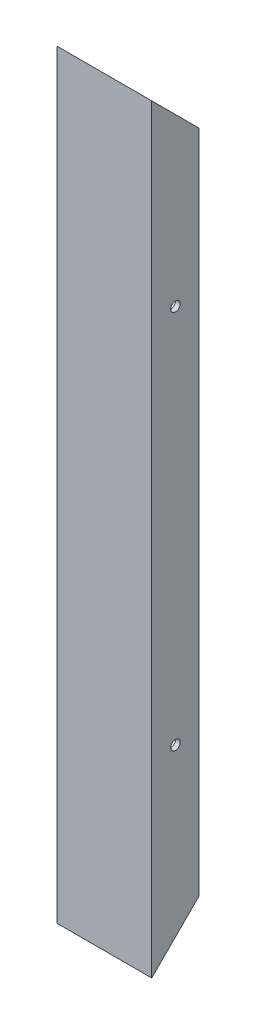
ISO-10303-21;
HEADER;
FILE_DESCRIPTION(('STEP AP214'),'2;1');
FILE_NAME('part.step','',(''),(''),'','','');
FILE_SCHEMA(('AUTOMOTIVE_DESIGN { 1 0 10303 214 1 1 1 1 }'));
ENDSEC;
DATA;
#1=APPLICATION_CONTEXT('core data for automotive mechanical design processes');
#2=APPLICATION_PROTOCOL_DEFINITION('international standard','automotive_design',2000,#1);
#3=PRODUCT_CONTEXT('',#1,'mechanical');
#4=PRODUCT('Part','Part','',(#3));
#5=PRODUCT_RELATED_PRODUCT_CATEGORY('part','',(#4));
#6=PRODUCT_DEFINITION_FORMATION('','',#4);
#7=PRODUCT_DEFINITION_CONTEXT('part definition',#1,'design');
#8=PRODUCT_DEFINITION('design','',#6,#7);
#9=PRODUCT_DEFINITION_SHAPE('','',#8);
#10=(LENGTH_UNIT() NAMED_UNIT(*) SI_UNIT(.MILLI.,.METRE.));
#11=(NAMED_UNIT(*) PLANE_ANGLE_UNIT() SI_UNIT($,.RADIAN.));
#12=(NAMED_UNIT(*) SI_UNIT($,.STERADIAN.) SOLID_ANGLE_UNIT());
#13=UNCERTAINTY_MEASURE_WITH_UNIT(LENGTH_MEASURE(1.E-05),#10,'distance_accuracy_value','');
#14=(GEOMETRIC_REPRESENTATION_CONTEXT(3) GLOBAL_UNCERTAINTY_ASSIGNED_CONTEXT((#13)) GLOBAL_UNIT_ASSIGNED_CONTEXT((#10,
#11,#12)) REPRESENTATION_CONTEXT('',''));
#15=CARTESIAN_POINT('',(0.,0.,0.));
#16=DIRECTION('',(0.,0.,1.));
#17=DIRECTION('',(1.,0.,0.));
#18=AXIS2_PLACEMENT_3D('',#15,#16,#17);
#19=CARTESIAN_POINT('',(-100.,0.,0.));
#20=DIRECTION('',(0.,0.,1.));
#21=DIRECTION('',(1.,0.,0.));
#22=AXIS2_PLACEMENT_3D('',#19,#20,#21);
#23=PLANE('',#22);
#24=DIRECTION('',(-1.,0.,0.));
#25=VECTOR('',#24,1.);
#26=CARTESIAN_POINT('',(0.,0.,0.));
#27=LINE('',#26,#25);
#28=CARTESIAN_POINT('',(0.,0.,0.));
#29=VERTEX_POINT('',#28);
#30=CARTESIAN_POINT('',(-100.,0.,0.));
#31=VERTEX_POINT('',#30);
#32=EDGE_CURVE('E175',#29,#31,#27,.T.);
#33=ORIENTED_EDGE('',*,*,#32,.F.);
#34=DIRECTION('',(0.,1.,0.));
#35=VECTOR('',#34,1.);
#36=CARTESIAN_POINT('',(0.,0.,0.));
#37=LINE('',#36,#35);
#38=CARTESIAN_POINT('',(0.,800.,0.));
#39=VERTEX_POINT('',#38);
#40=EDGE_CURVE('E196',#29,#39,#37,.T.);
#41=ORIENTED_EDGE('',*,*,#40,.T.);
#42=DIRECTION('',(1.,0.,0.));
#43=VECTOR('',#42,1.);
#44=CARTESIAN_POINT('',(0.,800.,0.));
#45=LINE('',#44,#43);
#46=CARTESIAN_POINT('',(-100.,800.,0.));
#47=VERTEX_POINT('',#46);
#48=EDGE_CURVE('E166',#47,#39,#45,.T.);
#49=ORIENTED_EDGE('',*,*,#48,.F.);
#50=DIRECTION('',(0.,1.,0.));
#51=VECTOR('',#50,1.);
#52=CARTESIAN_POINT('',(-100.,0.,0.));
#53=LINE('',#52,#51);
#54=EDGE_CURVE('E142',#31,#47,#53,.T.);
#55=ORIENTED_EDGE('',*,*,#54,.F.);
#56=EDGE_LOOP('',(#33,#41,#49,#55));
#57=FACE_BOUND('',#56,.T.);
#58=ADVANCED_FACE('F17',(#57),#23,.T.);
#59=CARTESIAN_POINT('',(-5.,0.,-5.));
#60=DIRECTION('',(0.,0.,-1.));
#61=DIRECTION('',(0.,-1.,0.));
#62=AXIS2_PLACEMENT_3D('',#59,#60,#61);
#63=PLANE('',#62);
#64=DIRECTION('',(1.,0.,0.));
#65=VECTOR('',#64,1.);
#66=CARTESIAN_POINT('',(-2.5,795.,-5.));
#67=LINE('',#66,#65);
#68=CARTESIAN_POINT('',(-95.,795.,-5.));
#69=VERTEX_POINT('',#68);
#70=CARTESIAN_POINT('',(-5.,795.,-5.));
#71=VERTEX_POINT('',#70);
#72=EDGE_CURVE('E21',#69,#71,#67,.T.);
#73=ORIENTED_EDGE('',*,*,#72,.T.);
#74=DIRECTION('',(0.,1.,0.));
#75=VECTOR('',#74,1.);
#76=CARTESIAN_POINT('',(-5.,0.,-5.));
#77=LINE('',#76,#75);
#78=CARTESIAN_POINT('',(-5.,5.,-5.));
#79=VERTEX_POINT('',#78);
#80=EDGE_CURVE('E208',#79,#71,#77,.T.);
#81=ORIENTED_EDGE('',*,*,#80,.F.);
#82=DIRECTION('',(-1.,0.,0.));
#83=VECTOR('',#82,1.);
#84=CARTESIAN_POINT('',(-2.5,5.,-5.));
#85=LINE('',#84,#83);
#86=CARTESIAN_POINT('',(-95.,5.,-5.));
#87=VERTEX_POINT('',#86);
#88=EDGE_CURVE('E221',#79,#87,#85,.T.);
#89=ORIENTED_EDGE('',*,*,#88,.T.);
#90=DIRECTION('',(0.,1.,0.));
#91=VECTOR('',#90,1.);
#92=CARTESIAN_POINT('',(-95.,0.,-5.));
#93=LINE('',#92,#91);
#94=EDGE_CURVE('E11',#87,#69,#93,.T.);
#95=ORIENTED_EDGE('',*,*,#94,.T.);
#96=EDGE_LOOP('',(#73,#81,#89,#95));
#97=FACE_BOUND('',#96,.T.);
#98=ADVANCED_FACE('F19',(#97),#63,.T.);
#99=CARTESIAN_POINT('',(-95.,0.,-5.));
#100=DIRECTION('',(1.,0.,0.));
#101=DIRECTION('',(0.,1.,0.));
#102=AXIS2_PLACEMENT_3D('',#99,#100,#101);
#103=PLANE('',#102);
#104=CARTESIAN_POINT('',(-95.,600.,-25.));
#105=DIRECTION('',(-1.,0.,0.));
#106=DIRECTION('',(0.,0.,1.));
#107=AXIS2_PLACEMENT_3D('',#104,#105,#106);
#108=CIRCLE('',#107,5.);
#109=CARTESIAN_POINT('',(-95.,600.,-30.));
#110=VERTEX_POINT('',#109);
#111=EDGE_CURVE('E190',#110,#110,#108,.T.);
#112=ORIENTED_EDGE('',*,*,#111,.T.);
#113=EDGE_LOOP('',(#112));
#114=FACE_BOUND('',#113,.T.);
#115=CARTESIAN_POINT('',(-95.,200.,-25.));
#116=DIRECTION('',(-1.,0.,0.));
#117=DIRECTION('',(0.,0.,1.));
#118=AXIS2_PLACEMENT_3D('',#115,#116,#117);
#119=CIRCLE('',#118,5.);
#120=CARTESIAN_POINT('',(-95.,200.,-30.));
#121=VERTEX_POINT('',#120);
#122=EDGE_CURVE('E257',#121,#121,#119,.T.);
#123=ORIENTED_EDGE('',*,*,#122,.T.);
#124=EDGE_LOOP('',(#123));
#125=FACE_BOUND('',#124,.T.);
#126=DIRECTION('',(0.,0.707106781186546,0.707106781186549));
#127=VECTOR('',#126,1.);
#128=CARTESIAN_POINT('',(-95.,573.75,-226.25));
#129=LINE('',#128,#127);
#130=CARTESIAN_POINT('',(-95.,750.,-50.));
#131=VERTEX_POINT('',#130);
#132=EDGE_CURVE('E135',#131,#69,#129,.T.);
#133=ORIENTED_EDGE('',*,*,#132,.T.);
#134=ORIENTED_EDGE('',*,*,#94,.F.);
#135=DIRECTION('',(0.,0.707106781186548,-0.707106781186548));
#136=VECTOR('',#135,1.);
#137=CARTESIAN_POINT('',(-95.,1.25,-1.25));
#138=LINE('',#137,#136);
#139=CARTESIAN_POINT('',(-95.,50.,-50.));
#140=VERTEX_POINT('',#139);
#141=EDGE_CURVE('E138',#87,#140,#138,.T.);
#142=ORIENTED_EDGE('',*,*,#141,.T.);
#143=DIRECTION('',(0.,1.,0.));
#144=VECTOR('',#143,1.);
#145=CARTESIAN_POINT('',(-95.,0.,-50.));
#146=LINE('',#145,#144);
#147=EDGE_CURVE('E28',#140,#131,#146,.T.);
#148=ORIENTED_EDGE('',*,*,#147,.T.);
#149=EDGE_LOOP('',(#133,#134,#142,#148));
#150=FACE_BOUND('',#149,.T.);
#151=ADVANCED_FACE('F133',(#114,#125,#150),#103,.T.);
#152=CARTESIAN_POINT('',(-95.,0.,-50.));
#153=DIRECTION('',(0.,0.,-1.));
#154=DIRECTION('',(0.,-1.,0.));
#155=AXIS2_PLACEMENT_3D('',#152,#153,#154);
#156=PLANE('',#155);
#157=DIRECTION('',(1.,0.,0.));
#158=VECTOR('',#157,1.);
#159=CARTESIAN_POINT('',(-47.5,750.,-50.));
#160=LINE('',#159,#158);
#161=CARTESIAN_POINT('',(-100.,750.,-50.));
#162=VERTEX_POINT('',#161);
#163=EDGE_CURVE('E145',#162,#131,#160,.T.);
#164=ORIENTED_EDGE('',*,*,#163,.T.);
#165=ORIENTED_EDGE('',*,*,#147,.F.);
#166=DIRECTION('',(-1.,0.,0.));
#167=VECTOR('',#166,1.);
#168=CARTESIAN_POINT('',(-47.5,50.,-50.));
#169=LINE('',#168,#167);
#170=CARTESIAN_POINT('',(-100.,50.,-50.));
#171=VERTEX_POINT('',#170);
#172=EDGE_CURVE('E209',#140,#171,#169,.T.);
#173=ORIENTED_EDGE('',*,*,#172,.T.);
#174=DIRECTION('',(0.,1.,0.));
#175=VECTOR('',#174,1.);
#176=CARTESIAN_POINT('',(-100.,0.,-50.));
#177=LINE('',#176,#175);
#178=EDGE_CURVE('E41',#171,#162,#177,.T.);
#179=ORIENTED_EDGE('',*,*,#178,.T.);
#180=EDGE_LOOP('',(#164,#165,#173,#179));
#181=FACE_BOUND('',#180,.T.);
#182=ADVANCED_FACE('F146',(#181),#156,.T.);
#183=CARTESIAN_POINT('',(-100.,0.,-50.));
#184=DIRECTION('',(-1.,0.,0.));
#185=DIRECTION('',(0.,0.,1.));
#186=AXIS2_PLACEMENT_3D('',#183,#184,#185);
#187=PLANE('',#186);
#188=CARTESIAN_POINT('',(-100.,600.,-25.));
#189=DIRECTION('',(1.,0.,0.));
#190=DIRECTION('',(0.,0.,1.));
#191=AXIS2_PLACEMENT_3D('',#188,#189,#190);
#192=CIRCLE('',#191,5.);
#193=CARTESIAN_POINT('',(-100.,600.,-30.));
#194=VERTEX_POINT('',#193);
#195=EDGE_CURVE('E192',#194,#194,#192,.T.);
#196=ORIENTED_EDGE('',*,*,#195,.T.);
#197=EDGE_LOOP('',(#196));
#198=FACE_BOUND('',#197,.T.);
#199=CARTESIAN_POINT('',(-100.,200.,-25.));
#200=DIRECTION('',(1.,0.,0.));
#201=DIRECTION('',(0.,0.,1.));
#202=AXIS2_PLACEMENT_3D('',#199,#200,#201);
#203=CIRCLE('',#202,5.);
#204=CARTESIAN_POINT('',(-100.,200.,-30.));
#205=VERTEX_POINT('',#204);
#206=EDGE_CURVE('E187',#205,#205,#203,.T.);
#207=ORIENTED_EDGE('',*,*,#206,.T.);
#208=EDGE_LOOP('',(#207));
#209=FACE_BOUND('',#208,.T.);
#210=DIRECTION('',(0.,-0.707106781186546,-0.707106781186549));
#211=VECTOR('',#210,1.);
#212=CARTESIAN_POINT('',(-100.,562.5,-237.5));
#213=LINE('',#212,#211);
#214=EDGE_CURVE('E150',#47,#162,#213,.T.);
#215=ORIENTED_EDGE('',*,*,#214,.T.);
#216=ORIENTED_EDGE('',*,*,#178,.F.);
#217=DIRECTION('',(0.,-0.707106781186548,0.707106781186548));
#218=VECTOR('',#217,1.);
#219=CARTESIAN_POINT('',(-100.,12.5,-12.5));
#220=LINE('',#219,#218);
#221=EDGE_CURVE('E220',#171,#31,#220,.T.);
#222=ORIENTED_EDGE('',*,*,#221,.T.);
#223=ORIENTED_EDGE('',*,*,#54,.T.);
#224=EDGE_LOOP('',(#215,#216,#222,#223));
#225=FACE_BOUND('',#224,.T.);
#226=ADVANCED_FACE('F284',(#198,#209,#225),#187,.T.);
#227=CARTESIAN_POINT('',(0.,0.,0.));
#228=DIRECTION('',(1.,0.,0.));
#229=DIRECTION('',(0.,1.,0.));
#230=AXIS2_PLACEMENT_3D('',#227,#228,#229);
#231=PLANE('',#230);
#232=CARTESIAN_POINT('',(0.,600.,-25.));
#233=DIRECTION('',(-1.,0.,0.));
#234=DIRECTION('',(0.,0.,1.));
#235=AXIS2_PLACEMENT_3D('',#232,#233,#234);
#236=CIRCLE('',#235,5.);
#237=CARTESIAN_POINT('',(0.,600.,-30.));
#238=VERTEX_POINT('',#237);
#239=EDGE_CURVE('E180',#238,#238,#236,.T.);
#240=ORIENTED_EDGE('',*,*,#239,.T.);
#241=EDGE_LOOP('',(#240));
#242=FACE_BOUND('',#241,.T.);
#243=CARTESIAN_POINT('',(0.,200.,-25.));
#244=DIRECTION('',(-1.,0.,0.));
#245=DIRECTION('',(0.,0.,1.));
#246=AXIS2_PLACEMENT_3D('',#243,#244,#245);
#247=CIRCLE('',#246,5.);
#248=CARTESIAN_POINT('',(0.,200.,-30.));
#249=VERTEX_POINT('',#248);
#250=EDGE_CURVE('E182',#249,#249,#247,.T.);
#251=ORIENTED_EDGE('',*,*,#250,.T.);
#252=EDGE_LOOP('',(#251));
#253=FACE_BOUND('',#252,.T.);
#254=DIRECTION('',(0.,0.707106781186546,0.707106781186549));
#255=VECTOR('',#254,1.);
#256=CARTESIAN_POINT('',(0.,575.,-225.));
#257=LINE('',#256,#255);
#258=CARTESIAN_POINT('',(0.,750.,-50.));
#259=VERTEX_POINT('',#258);
#260=EDGE_CURVE('E170',#259,#39,#257,.T.);
#261=ORIENTED_EDGE('',*,*,#260,.T.);
#262=ORIENTED_EDGE('',*,*,#40,.F.);
#263=DIRECTION('',(0.,0.707106781186548,-0.707106781186548));
#264=VECTOR('',#263,1.);
#265=CARTESIAN_POINT('',(0.,0.,0.));
#266=LINE('',#265,#264);
#267=CARTESIAN_POINT('',(0.,50.,-50.));
#268=VERTEX_POINT('',#267);
#269=EDGE_CURVE('E171',#29,#268,#266,.T.);
#270=ORIENTED_EDGE('',*,*,#269,.T.);
#271=DIRECTION('',(0.,1.,0.));
#272=VECTOR('',#271,1.);
#273=CARTESIAN_POINT('',(0.,0.,-50.));
#274=LINE('',#273,#272);
#275=EDGE_CURVE('E199',#268,#259,#274,.T.);
#276=ORIENTED_EDGE('',*,*,#275,.T.);
#277=EDGE_LOOP('',(#261,#262,#270,#276));
#278=FACE_BOUND('',#277,.T.);
#279=ADVANCED_FACE('F280',(#242,#253,#278),#231,.T.);
#280=CARTESIAN_POINT('',(0.,0.,-50.));
#281=DIRECTION('',(0.,0.,-1.));
#282=DIRECTION('',(0.,-1.,0.));
#283=AXIS2_PLACEMENT_3D('',#280,#281,#282);
#284=PLANE('',#283);
#285=DIRECTION('',(1.,0.,0.));
#286=VECTOR('',#285,1.);
#287=CARTESIAN_POINT('',(0.,750.,-50.));
#288=LINE('',#287,#286);
#289=CARTESIAN_POINT('',(-5.,750.,-50.));
#290=VERTEX_POINT('',#289);
#291=EDGE_CURVE('E235',#290,#259,#288,.T.);
#292=ORIENTED_EDGE('',*,*,#291,.T.);
#293=ORIENTED_EDGE('',*,*,#275,.F.);
#294=DIRECTION('',(-1.,0.,0.));
#295=VECTOR('',#294,1.);
#296=CARTESIAN_POINT('',(0.,50.,-50.));
#297=LINE('',#296,#295);
#298=CARTESIAN_POINT('',(-5.,50.,-50.));
#299=VERTEX_POINT('',#298);
#300=EDGE_CURVE('E176',#268,#299,#297,.T.);
#301=ORIENTED_EDGE('',*,*,#300,.T.);
#302=DIRECTION('',(0.,1.,0.));
#303=VECTOR('',#302,1.);
#304=CARTESIAN_POINT('',(-5.,0.,-50.));
#305=LINE('',#304,#303);
#306=EDGE_CURVE('E205',#299,#290,#305,.T.);
#307=ORIENTED_EDGE('',*,*,#306,.T.);
#308=EDGE_LOOP('',(#292,#293,#301,#307));
#309=FACE_BOUND('',#308,.T.);
#310=ADVANCED_FACE('F283',(#309),#284,.T.);
#311=CARTESIAN_POINT('',(-5.,0.,-50.));
#312=DIRECTION('',(-1.,0.,0.));
#313=DIRECTION('',(0.,0.,1.));
#314=AXIS2_PLACEMENT_3D('',#311,#312,#313);
#315=PLANE('',#314);
#316=CARTESIAN_POINT('',(-5.,600.,-25.));
#317=DIRECTION('',(1.,0.,0.));
#318=DIRECTION('',(0.,0.,1.));
#319=AXIS2_PLACEMENT_3D('',#316,#317,#318);
#320=CIRCLE('',#319,5.);
#321=CARTESIAN_POINT('',(-5.,600.,-30.));
#322=VERTEX_POINT('',#321);
#323=EDGE_CURVE('E164',#322,#322,#320,.T.);
#324=ORIENTED_EDGE('',*,*,#323,.T.);
#325=EDGE_LOOP('',(#324));
#326=FACE_BOUND('',#325,.T.);
#327=CARTESIAN_POINT('',(-5.,200.,-25.));
#328=DIRECTION('',(1.,0.,0.));
#329=DIRECTION('',(0.,0.,1.));
#330=AXIS2_PLACEMENT_3D('',#327,#328,#329);
#331=CIRCLE('',#330,5.);
#332=CARTESIAN_POINT('',(-5.,200.,-30.));
#333=VERTEX_POINT('',#332);
#334=EDGE_CURVE('E188',#333,#333,#331,.T.);
#335=ORIENTED_EDGE('',*,*,#334,.T.);
#336=EDGE_LOOP('',(#335));
#337=FACE_BOUND('',#336,.T.);
#338=DIRECTION('',(0.,-0.707106781186546,-0.707106781186549));
#339=VECTOR('',#338,1.);
#340=CARTESIAN_POINT('',(-4.99999999999994,562.5,-237.5));
#341=LINE('',#340,#339);
#342=EDGE_CURVE('E161',#71,#290,#341,.T.);
#343=ORIENTED_EDGE('',*,*,#342,.T.);
#344=ORIENTED_EDGE('',*,*,#306,.F.);
#345=DIRECTION('',(0.,-0.707106781186548,0.707106781186548));
#346=VECTOR('',#345,1.);
#347=CARTESIAN_POINT('',(-5.,12.5,-12.5));
#348=LINE('',#347,#346);
#349=EDGE_CURVE('E225',#299,#79,#348,.T.);
#350=ORIENTED_EDGE('',*,*,#349,.T.);
#351=ORIENTED_EDGE('',*,*,#80,.T.);
#352=EDGE_LOOP('',(#343,#344,#350,#351));
#353=FACE_BOUND('',#352,.T.);
#354=ADVANCED_FACE('F302',(#326,#337,#353),#315,.T.);
#355=CARTESIAN_POINT('',(0.,0.,0.));
#356=DIRECTION('',(0.,0.707106781186548,0.707106781186548));
#357=DIRECTION('',(1.,0.,0.));
#358=AXIS2_PLACEMENT_3D('',#355,#356,#357);
#359=PLANE('',#358);
#360=ORIENTED_EDGE('',*,*,#141,.F.);
#361=ORIENTED_EDGE('',*,*,#88,.F.);
#362=ORIENTED_EDGE('',*,*,#349,.F.);
#363=ORIENTED_EDGE('',*,*,#300,.F.);
#364=ORIENTED_EDGE('',*,*,#269,.F.);
#365=ORIENTED_EDGE('',*,*,#32,.T.);
#366=ORIENTED_EDGE('',*,*,#221,.F.);
#367=ORIENTED_EDGE('',*,*,#172,.F.);
#368=EDGE_LOOP('',(#360,#361,#362,#363,#364,#365,#366,#367));
#369=FACE_BOUND('',#368,.T.);
#370=ADVANCED_FACE('F297',(#369),#359,.F.);
#371=CARTESIAN_POINT('',(0.,750.,-50.));
#372=DIRECTION('',(0.,-0.707106781186549,0.707106781186546));
#373=DIRECTION('',(-1.,0.,0.));
#374=AXIS2_PLACEMENT_3D('',#371,#372,#373);
#375=PLANE('',#374);
#376=ORIENTED_EDGE('',*,*,#342,.F.);
#377=ORIENTED_EDGE('',*,*,#72,.F.);
#378=ORIENTED_EDGE('',*,*,#132,.F.);
#379=ORIENTED_EDGE('',*,*,#163,.F.);
#380=ORIENTED_EDGE('',*,*,#214,.F.);
#381=ORIENTED_EDGE('',*,*,#48,.T.);
#382=ORIENTED_EDGE('',*,*,#260,.F.);
#383=ORIENTED_EDGE('',*,*,#291,.F.);
#384=EDGE_LOOP('',(#376,#377,#378,#379,#380,#381,#382,#383));
#385=FACE_BOUND('',#384,.T.);
#386=ADVANCED_FACE('F153',(#385),#375,.F.);
#387=CARTESIAN_POINT('',(0.,600.,-25.));
#388=DIRECTION('',(-1.,0.,0.));
#389=DIRECTION('',(0.,0.,1.));
#390=AXIS2_PLACEMENT_3D('',#387,#388,#389);
#391=CYLINDRICAL_SURFACE('',#390,5.);
#392=ORIENTED_EDGE('',*,*,#239,.F.);
#393=DIRECTION('',(-1.,0.,0.));
#394=VECTOR('',#393,1.);
#395=CARTESIAN_POINT('',(0.,600.,-30.));
#396=LINE('',#395,#394);
#397=EDGE_CURVE('E177',#238,#322,#396,.T.);
#398=ORIENTED_EDGE('',*,*,#397,.T.);
#399=ORIENTED_EDGE('',*,*,#323,.F.);
#400=ORIENTED_EDGE('',*,*,#397,.F.);
#401=EDGE_LOOP('',(#392,#398,#399,#400));
#402=FACE_BOUND('',#401,.T.);
#403=ADVANCED_FACE('F320',(#402),#391,.F.);
#404=CARTESIAN_POINT('',(0.,600.,-25.));
#405=DIRECTION('',(-1.,0.,0.));
#406=DIRECTION('',(0.,0.,1.));
#407=AXIS2_PLACEMENT_3D('',#404,#405,#406);
#408=CYLINDRICAL_SURFACE('',#407,5.);
#409=ORIENTED_EDGE('',*,*,#111,.F.);
#410=DIRECTION('',(-1.,0.,0.));
#411=VECTOR('',#410,1.);
#412=CARTESIAN_POINT('',(0.,600.,-30.));
#413=LINE('',#412,#411);
#414=EDGE_CURVE('E195',#110,#194,#413,.T.);
#415=ORIENTED_EDGE('',*,*,#414,.T.);
#416=ORIENTED_EDGE('',*,*,#195,.F.);
#417=ORIENTED_EDGE('',*,*,#414,.F.);
#418=EDGE_LOOP('',(#409,#415,#416,#417));
#419=FACE_BOUND('',#418,.T.);
#420=ADVANCED_FACE('F323',(#419),#408,.F.);
#421=CARTESIAN_POINT('',(0.,200.,-25.));
#422=DIRECTION('',(-1.,0.,0.));
#423=DIRECTION('',(0.,0.,1.));
#424=AXIS2_PLACEMENT_3D('',#421,#422,#423);
#425=CYLINDRICAL_SURFACE('',#424,5.);
#426=ORIENTED_EDGE('',*,*,#250,.F.);
#427=DIRECTION('',(-1.,0.,0.));
#428=VECTOR('',#427,1.);
#429=CARTESIAN_POINT('',(0.,200.,-30.));
#430=LINE('',#429,#428);
#431=EDGE_CURVE('E186',#249,#333,#430,.T.);
#432=ORIENTED_EDGE('',*,*,#431,.T.);
#433=ORIENTED_EDGE('',*,*,#334,.F.);
#434=ORIENTED_EDGE('',*,*,#431,.F.);
#435=EDGE_LOOP('',(#426,#432,#433,#434));
#436=FACE_BOUND('',#435,.T.);
#437=ADVANCED_FACE('F278',(#436),#425,.F.);
#438=CARTESIAN_POINT('',(0.,200.,-25.));
#439=DIRECTION('',(-1.,0.,0.));
#440=DIRECTION('',(0.,0.,1.));
#441=AXIS2_PLACEMENT_3D('',#438,#439,#440);
#442=CYLINDRICAL_SURFACE('',#441,5.);
#443=ORIENTED_EDGE('',*,*,#122,.F.);
#444=DIRECTION('',(-1.,0.,0.));
#445=VECTOR('',#444,1.);
#446=CARTESIAN_POINT('',(0.,200.,-30.));
#447=LINE('',#446,#445);
#448=EDGE_CURVE('E249',#121,#205,#447,.T.);
#449=ORIENTED_EDGE('',*,*,#448,.T.);
#450=ORIENTED_EDGE('',*,*,#206,.F.);
#451=ORIENTED_EDGE('',*,*,#448,.F.);
#452=EDGE_LOOP('',(#443,#449,#450,#451));
#453=FACE_BOUND('',#452,.T.);
#454=ADVANCED_FACE('F326',(#453),#442,.F.);
#455=CLOSED_SHELL('',(#58,#98,#151,#182,#226,#279,#310,#354,#370,#386,#403,#420,#437,#454));
#456=MANIFOLD_SOLID_BREP('B1',#455);
#457=ADVANCED_BREP_SHAPE_REPRESENTATION('',(#18,#456),#14);
#458=SHAPE_DEFINITION_REPRESENTATION(#9,#457);
ENDSEC;
END-ISO-10303-21;
